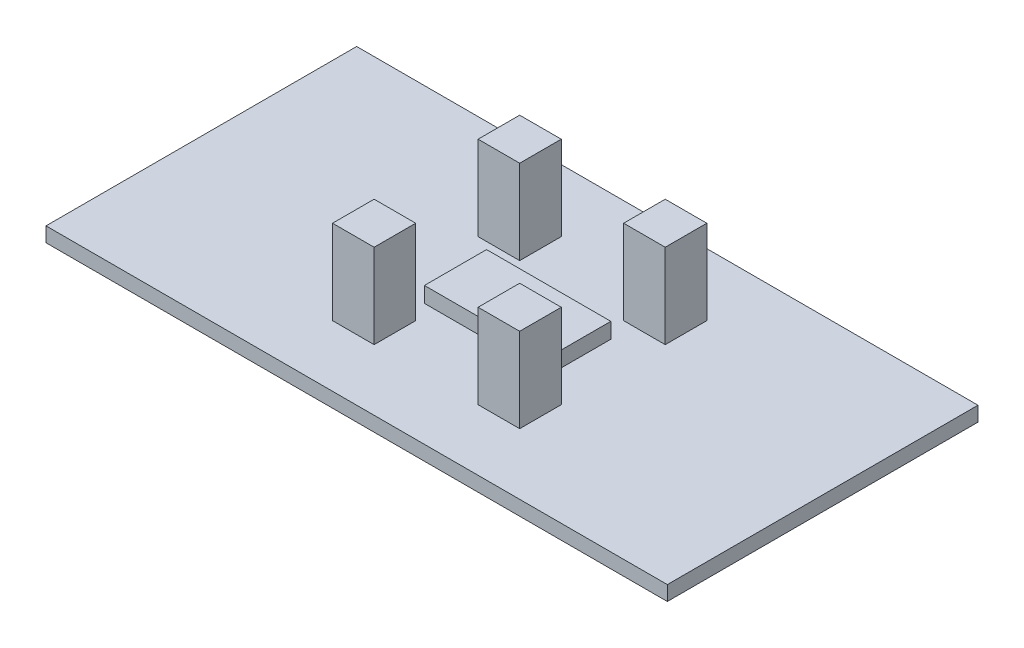
ISO-10303-21;
HEADER;
FILE_DESCRIPTION(('STEP AP214'),'2;1');
FILE_NAME('part.step','',(''),(''),'','','');
FILE_SCHEMA(('AUTOMOTIVE_DESIGN { 1 0 10303 214 1 1 1 1 }'));
ENDSEC;
DATA;
#1=APPLICATION_CONTEXT('core data for automotive mechanical design processes');
#2=APPLICATION_PROTOCOL_DEFINITION('international standard','automotive_design',2000,#1);
#3=PRODUCT_CONTEXT('',#1,'mechanical');
#4=PRODUCT('Part','Part','',(#3));
#5=PRODUCT_RELATED_PRODUCT_CATEGORY('part','',(#4));
#6=PRODUCT_DEFINITION_FORMATION('','',#4);
#7=PRODUCT_DEFINITION_CONTEXT('part definition',#1,'design');
#8=PRODUCT_DEFINITION('design','',#6,#7);
#9=PRODUCT_DEFINITION_SHAPE('','',#8);
#10=(LENGTH_UNIT() NAMED_UNIT(*) SI_UNIT(.MILLI.,.METRE.));
#11=(NAMED_UNIT(*) PLANE_ANGLE_UNIT() SI_UNIT($,.RADIAN.));
#12=(NAMED_UNIT(*) SI_UNIT($,.STERADIAN.) SOLID_ANGLE_UNIT());
#13=UNCERTAINTY_MEASURE_WITH_UNIT(LENGTH_MEASURE(1.E-05),#10,'distance_accuracy_value','');
#14=(GEOMETRIC_REPRESENTATION_CONTEXT(3) GLOBAL_UNCERTAINTY_ASSIGNED_CONTEXT((#13)) GLOBAL_UNIT_ASSIGNED_CONTEXT((#10,
#11,#12)) REPRESENTATION_CONTEXT('',''));
#15=CARTESIAN_POINT('',(0.,0.,0.));
#16=DIRECTION('',(0.,0.,1.));
#17=DIRECTION('',(1.,0.,0.));
#18=AXIS2_PLACEMENT_3D('',#15,#16,#17);
#19=CARTESIAN_POINT('',(15.4033333333334,81.,38.1619047619049));
#20=DIRECTION('',(1.,0.,0.));
#21=DIRECTION('',(0.,0.,-1.));
#22=AXIS2_PLACEMENT_3D('',#19,#20,#21);
#23=PLANE('',#22);
#24=DIRECTION('',(0.,0.,1.));
#25=VECTOR('',#24,1.);
#26=CARTESIAN_POINT('',(15.4033333333334,12.,38.1619047619049));
#27=LINE('',#26,#25);
#28=CARTESIAN_POINT('',(15.4033333333334,12.,38.1619047619049));
#29=VERTEX_POINT('',#28);
#30=CARTESIAN_POINT('',(15.4033333333334,12.,72.1619047619049));
#31=VERTEX_POINT('',#30);
#32=EDGE_CURVE('E113',#29,#31,#27,.T.);
#33=ORIENTED_EDGE('',*,*,#32,.T.);
#34=DIRECTION('',(0.,-1.,0.));
#35=VECTOR('',#34,1.);
#36=CARTESIAN_POINT('',(15.4033333333334,81.,72.1619047619049));
#37=LINE('',#36,#35);
#38=CARTESIAN_POINT('',(15.4033333333334,81.,72.1619047619049));
#39=VERTEX_POINT('',#38);
#40=EDGE_CURVE('E12',#39,#31,#37,.T.);
#41=ORIENTED_EDGE('',*,*,#40,.F.);
#42=DIRECTION('',(0.,0.,1.));
#43=VECTOR('',#42,1.);
#44=CARTESIAN_POINT('',(15.4033333333334,81.,38.1619047619049));
#45=LINE('',#44,#43);
#46=CARTESIAN_POINT('',(15.4033333333334,81.,38.1619047619049));
#47=VERTEX_POINT('',#46);
#48=EDGE_CURVE('E101',#47,#39,#45,.T.);
#49=ORIENTED_EDGE('',*,*,#48,.F.);
#50=DIRECTION('',(0.,-1.,0.));
#51=VECTOR('',#50,1.);
#52=CARTESIAN_POINT('',(15.4033333333334,81.,38.1619047619049));
#53=LINE('',#52,#51);
#54=EDGE_CURVE('E109',#47,#29,#53,.T.);
#55=ORIENTED_EDGE('',*,*,#54,.T.);
#56=EDGE_LOOP('',(#33,#41,#49,#55));
#57=FACE_BOUND('',#56,.T.);
#58=ADVANCED_FACE('F50',(#57),#23,.F.);
#59=CARTESIAN_POINT('',(15.4033333333334,81.,72.1619047619049));
#60=DIRECTION('',(0.,0.,-1.));
#61=DIRECTION('',(-1.,0.,0.));
#62=AXIS2_PLACEMENT_3D('',#59,#60,#61);
#63=PLANE('',#62);
#64=DIRECTION('',(1.,0.,0.));
#65=VECTOR('',#64,1.);
#66=CARTESIAN_POINT('',(15.4033333333334,12.,72.1619047619049));
#67=LINE('',#66,#65);
#68=CARTESIAN_POINT('',(49.4033333333335,12.,72.1619047619049));
#69=VERTEX_POINT('',#68);
#70=EDGE_CURVE('E105',#31,#69,#67,.T.);
#71=ORIENTED_EDGE('',*,*,#70,.T.);
#72=DIRECTION('',(0.,-1.,0.));
#73=VECTOR('',#72,1.);
#74=CARTESIAN_POINT('',(49.4033333333335,81.,72.1619047619049));
#75=LINE('',#74,#73);
#76=CARTESIAN_POINT('',(49.4033333333335,81.,72.1619047619049));
#77=VERTEX_POINT('',#76);
#78=EDGE_CURVE('E58',#77,#69,#75,.T.);
#79=ORIENTED_EDGE('',*,*,#78,.F.);
#80=DIRECTION('',(1.,0.,0.));
#81=VECTOR('',#80,1.);
#82=CARTESIAN_POINT('',(15.4033333333334,81.,72.1619047619049));
#83=LINE('',#82,#81);
#84=EDGE_CURVE('E96',#39,#77,#83,.T.);
#85=ORIENTED_EDGE('',*,*,#84,.F.);
#86=ORIENTED_EDGE('',*,*,#40,.T.);
#87=EDGE_LOOP('',(#71,#79,#85,#86));
#88=FACE_BOUND('',#87,.T.);
#89=ADVANCED_FACE('F104',(#88),#63,.F.);
#90=CARTESIAN_POINT('',(49.4033333333336,81.,38.1619047619049));
#91=DIRECTION('',(-1.,0.,0.));
#92=DIRECTION('',(0.,0.,1.));
#93=AXIS2_PLACEMENT_3D('',#90,#91,#92);
#94=PLANE('',#93);
#95=DIRECTION('',(0.,0.,-1.));
#96=VECTOR('',#95,1.);
#97=CARTESIAN_POINT('',(49.4033333333336,12.,38.1619047619049));
#98=LINE('',#97,#96);
#99=CARTESIAN_POINT('',(49.4033333333336,12.,38.1619047619049));
#100=VERTEX_POINT('',#99);
#101=EDGE_CURVE('E83',#69,#100,#98,.T.);
#102=ORIENTED_EDGE('',*,*,#101,.T.);
#103=DIRECTION('',(0.,-1.,0.));
#104=VECTOR('',#103,1.);
#105=CARTESIAN_POINT('',(49.4033333333336,81.,38.1619047619049));
#106=LINE('',#105,#104);
#107=CARTESIAN_POINT('',(49.4033333333336,81.,38.1619047619049));
#108=VERTEX_POINT('',#107);
#109=EDGE_CURVE('E106',#108,#100,#106,.T.);
#110=ORIENTED_EDGE('',*,*,#109,.F.);
#111=DIRECTION('',(0.,0.,-1.));
#112=VECTOR('',#111,1.);
#113=CARTESIAN_POINT('',(49.4033333333336,81.,38.1619047619049));
#114=LINE('',#113,#112);
#115=EDGE_CURVE('E99',#77,#108,#114,.T.);
#116=ORIENTED_EDGE('',*,*,#115,.F.);
#117=ORIENTED_EDGE('',*,*,#78,.T.);
#118=EDGE_LOOP('',(#102,#110,#116,#117));
#119=FACE_BOUND('',#118,.T.);
#120=ADVANCED_FACE('F107',(#119),#94,.F.);
#121=CARTESIAN_POINT('',(15.4033333333334,81.,38.1619047619049));
#122=DIRECTION('',(0.,0.,1.));
#123=DIRECTION('',(1.,0.,0.));
#124=AXIS2_PLACEMENT_3D('',#121,#122,#123);
#125=PLANE('',#124);
#126=DIRECTION('',(-1.,0.,0.));
#127=VECTOR('',#126,1.);
#128=CARTESIAN_POINT('',(15.4033333333334,12.,38.1619047619049));
#129=LINE('',#128,#127);
#130=EDGE_CURVE('E89',#100,#29,#129,.T.);
#131=ORIENTED_EDGE('',*,*,#130,.T.);
#132=ORIENTED_EDGE('',*,*,#54,.F.);
#133=DIRECTION('',(-1.,0.,0.));
#134=VECTOR('',#133,1.);
#135=CARTESIAN_POINT('',(15.4033333333334,81.,38.1619047619049));
#136=LINE('',#135,#134);
#137=EDGE_CURVE('E66',#108,#47,#136,.T.);
#138=ORIENTED_EDGE('',*,*,#137,.F.);
#139=ORIENTED_EDGE('',*,*,#109,.T.);
#140=EDGE_LOOP('',(#131,#132,#138,#139));
#141=FACE_BOUND('',#140,.T.);
#142=ADVANCED_FACE('F120',(#141),#125,.F.);
#143=CARTESIAN_POINT('',(0.,81.,0.));
#144=DIRECTION('',(0.,1.,0.));
#145=DIRECTION('',(0.,0.,1.));
#146=AXIS2_PLACEMENT_3D('',#143,#144,#145);
#147=PLANE('',#146);
#148=ORIENTED_EDGE('',*,*,#48,.T.);
#149=ORIENTED_EDGE('',*,*,#84,.T.);
#150=ORIENTED_EDGE('',*,*,#115,.T.);
#151=ORIENTED_EDGE('',*,*,#137,.T.);
#152=EDGE_LOOP('',(#148,#149,#150,#151));
#153=FACE_BOUND('',#152,.T.);
#154=ADVANCED_FACE('F97',(#153),#147,.T.);
#155=CARTESIAN_POINT('',(0.,12.,0.));
#156=DIRECTION('',(0.,1.,0.));
#157=DIRECTION('',(0.,0.,1.));
#158=AXIS2_PLACEMENT_3D('',#155,#156,#157);
#159=PLANE('',#158);
#160=ORIENTED_EDGE('',*,*,#32,.F.);
#161=ORIENTED_EDGE('',*,*,#130,.F.);
#162=ORIENTED_EDGE('',*,*,#101,.F.);
#163=ORIENTED_EDGE('',*,*,#70,.F.);
#164=EDGE_LOOP('',(#160,#161,#162,#163));
#165=FACE_BOUND('',#164,.T.);
#166=ADVANCED_FACE('F123',(#165),#159,.F.);
#167=CLOSED_SHELL('',(#58,#89,#120,#142,#154,#166));
#168=MANIFOLD_SOLID_BREP('B2',#167);
#169=CARTESIAN_POINT('',(-103.596666666667,81.,38.1619047619048));
#170=DIRECTION('',(1.,0.,0.));
#171=DIRECTION('',(0.,0.,-1.));
#172=AXIS2_PLACEMENT_3D('',#169,#170,#171);
#173=PLANE('',#172);
#174=DIRECTION('',(0.,0.,1.));
#175=VECTOR('',#174,1.);
#176=CARTESIAN_POINT('',(-103.596666666667,12.,38.1619047619048));
#177=LINE('',#176,#175);
#178=CARTESIAN_POINT('',(-103.596666666667,12.,38.1619047619048));
#179=VERTEX_POINT('',#178);
#180=CARTESIAN_POINT('',(-103.596666666667,12.,72.1619047619048));
#181=VERTEX_POINT('',#180);
#182=EDGE_CURVE('E247',#179,#181,#177,.T.);
#183=ORIENTED_EDGE('',*,*,#182,.T.);
#184=DIRECTION('',(0.,-1.,0.));
#185=VECTOR('',#184,1.);
#186=CARTESIAN_POINT('',(-103.596666666667,81.,72.1619047619048));
#187=LINE('',#186,#185);
#188=CARTESIAN_POINT('',(-103.596666666667,81.,72.1619047619048));
#189=VERTEX_POINT('',#188);
#190=EDGE_CURVE('E48',#189,#181,#187,.T.);
#191=ORIENTED_EDGE('',*,*,#190,.F.);
#192=DIRECTION('',(0.,0.,1.));
#193=VECTOR('',#192,1.);
#194=CARTESIAN_POINT('',(-103.596666666667,81.,38.1619047619048));
#195=LINE('',#194,#193);
#196=CARTESIAN_POINT('',(-103.596666666667,81.,38.1619047619048));
#197=VERTEX_POINT('',#196);
#198=EDGE_CURVE('E235',#197,#189,#195,.T.);
#199=ORIENTED_EDGE('',*,*,#198,.F.);
#200=DIRECTION('',(0.,-1.,0.));
#201=VECTOR('',#200,1.);
#202=CARTESIAN_POINT('',(-103.596666666667,81.,38.1619047619048));
#203=LINE('',#202,#201);
#204=EDGE_CURVE('E243',#197,#179,#203,.T.);
#205=ORIENTED_EDGE('',*,*,#204,.T.);
#206=EDGE_LOOP('',(#183,#191,#199,#205));
#207=FACE_BOUND('',#206,.T.);
#208=ADVANCED_FACE('F184',(#207),#173,.F.);
#209=CARTESIAN_POINT('',(-103.596666666667,81.,72.1619047619048));
#210=DIRECTION('',(0.,0.,-1.));
#211=DIRECTION('',(-1.,0.,0.));
#212=AXIS2_PLACEMENT_3D('',#209,#210,#211);
#213=PLANE('',#212);
#214=DIRECTION('',(1.,0.,0.));
#215=VECTOR('',#214,1.);
#216=CARTESIAN_POINT('',(-103.596666666667,12.,72.1619047619048));
#217=LINE('',#216,#215);
#218=CARTESIAN_POINT('',(-69.5966666666666,12.,72.1619047619048));
#219=VERTEX_POINT('',#218);
#220=EDGE_CURVE('E239',#181,#219,#217,.T.);
#221=ORIENTED_EDGE('',*,*,#220,.T.);
#222=DIRECTION('',(0.,-1.,0.));
#223=VECTOR('',#222,1.);
#224=CARTESIAN_POINT('',(-69.5966666666666,81.,72.1619047619048));
#225=LINE('',#224,#223);
#226=CARTESIAN_POINT('',(-69.5966666666666,81.,72.1619047619048));
#227=VERTEX_POINT('',#226);
#228=EDGE_CURVE('E192',#227,#219,#225,.T.);
#229=ORIENTED_EDGE('',*,*,#228,.F.);
#230=DIRECTION('',(1.,0.,0.));
#231=VECTOR('',#230,1.);
#232=CARTESIAN_POINT('',(-103.596666666667,81.,72.1619047619048));
#233=LINE('',#232,#231);
#234=EDGE_CURVE('E230',#189,#227,#233,.T.);
#235=ORIENTED_EDGE('',*,*,#234,.F.);
#236=ORIENTED_EDGE('',*,*,#190,.T.);
#237=EDGE_LOOP('',(#221,#229,#235,#236));
#238=FACE_BOUND('',#237,.T.);
#239=ADVANCED_FACE('F238',(#238),#213,.F.);
#240=CARTESIAN_POINT('',(-69.5966666666666,81.,38.1619047619049));
#241=DIRECTION('',(-1.,0.,0.));
#242=DIRECTION('',(0.,0.,1.));
#243=AXIS2_PLACEMENT_3D('',#240,#241,#242);
#244=PLANE('',#243);
#245=DIRECTION('',(0.,0.,-1.));
#246=VECTOR('',#245,1.);
#247=CARTESIAN_POINT('',(-69.5966666666666,12.,38.1619047619049));
#248=LINE('',#247,#246);
#249=CARTESIAN_POINT('',(-69.5966666666666,12.,38.1619047619049));
#250=VERTEX_POINT('',#249);
#251=EDGE_CURVE('E217',#219,#250,#248,.T.);
#252=ORIENTED_EDGE('',*,*,#251,.T.);
#253=DIRECTION('',(0.,-1.,0.));
#254=VECTOR('',#253,1.);
#255=CARTESIAN_POINT('',(-69.5966666666666,81.,38.1619047619049));
#256=LINE('',#255,#254);
#257=CARTESIAN_POINT('',(-69.5966666666666,81.,38.1619047619049));
#258=VERTEX_POINT('',#257);
#259=EDGE_CURVE('E240',#258,#250,#256,.T.);
#260=ORIENTED_EDGE('',*,*,#259,.F.);
#261=DIRECTION('',(0.,0.,-1.));
#262=VECTOR('',#261,1.);
#263=CARTESIAN_POINT('',(-69.5966666666666,81.,38.1619047619049));
#264=LINE('',#263,#262);
#265=EDGE_CURVE('E233',#227,#258,#264,.T.);
#266=ORIENTED_EDGE('',*,*,#265,.F.);
#267=ORIENTED_EDGE('',*,*,#228,.T.);
#268=EDGE_LOOP('',(#252,#260,#266,#267));
#269=FACE_BOUND('',#268,.T.);
#270=ADVANCED_FACE('F241',(#269),#244,.F.);
#271=CARTESIAN_POINT('',(-103.596666666667,81.,38.1619047619048));
#272=DIRECTION('',(0.,0.,1.));
#273=DIRECTION('',(1.,0.,0.));
#274=AXIS2_PLACEMENT_3D('',#271,#272,#273);
#275=PLANE('',#274);
#276=DIRECTION('',(-1.,0.,0.));
#277=VECTOR('',#276,1.);
#278=CARTESIAN_POINT('',(-103.596666666667,12.,38.1619047619048));
#279=LINE('',#278,#277);
#280=EDGE_CURVE('E223',#250,#179,#279,.T.);
#281=ORIENTED_EDGE('',*,*,#280,.T.);
#282=ORIENTED_EDGE('',*,*,#204,.F.);
#283=DIRECTION('',(-1.,0.,0.));
#284=VECTOR('',#283,1.);
#285=CARTESIAN_POINT('',(-103.596666666667,81.,38.1619047619048));
#286=LINE('',#285,#284);
#287=EDGE_CURVE('E200',#258,#197,#286,.T.);
#288=ORIENTED_EDGE('',*,*,#287,.F.);
#289=ORIENTED_EDGE('',*,*,#259,.T.);
#290=EDGE_LOOP('',(#281,#282,#288,#289));
#291=FACE_BOUND('',#290,.T.);
#292=ADVANCED_FACE('F254',(#291),#275,.F.);
#293=CARTESIAN_POINT('',(0.,81.,0.));
#294=DIRECTION('',(0.,1.,0.));
#295=DIRECTION('',(0.,0.,1.));
#296=AXIS2_PLACEMENT_3D('',#293,#294,#295);
#297=PLANE('',#296);
#298=ORIENTED_EDGE('',*,*,#198,.T.);
#299=ORIENTED_EDGE('',*,*,#234,.T.);
#300=ORIENTED_EDGE('',*,*,#265,.T.);
#301=ORIENTED_EDGE('',*,*,#287,.T.);
#302=EDGE_LOOP('',(#298,#299,#300,#301));
#303=FACE_BOUND('',#302,.T.);
#304=ADVANCED_FACE('F231',(#303),#297,.T.);
#305=CARTESIAN_POINT('',(0.,12.,0.));
#306=DIRECTION('',(0.,1.,0.));
#307=DIRECTION('',(0.,0.,1.));
#308=AXIS2_PLACEMENT_3D('',#305,#306,#307);
#309=PLANE('',#308);
#310=ORIENTED_EDGE('',*,*,#182,.F.);
#311=ORIENTED_EDGE('',*,*,#280,.F.);
#312=ORIENTED_EDGE('',*,*,#251,.F.);
#313=ORIENTED_EDGE('',*,*,#220,.F.);
#314=EDGE_LOOP('',(#310,#311,#312,#313));
#315=FACE_BOUND('',#314,.T.);
#316=ADVANCED_FACE('F257',(#315),#309,.F.);
#317=CLOSED_SHELL('',(#208,#239,#270,#292,#304,#316));
#318=MANIFOLD_SOLID_BREP('B6',#317);
#319=CARTESIAN_POINT('',(-103.596666666667,81.,-80.8380952380952));
#320=DIRECTION('',(1.,0.,0.));
#321=DIRECTION('',(0.,0.,-1.));
#322=AXIS2_PLACEMENT_3D('',#319,#320,#321);
#323=PLANE('',#322);
#324=DIRECTION('',(0.,0.,1.));
#325=VECTOR('',#324,1.);
#326=CARTESIAN_POINT('',(-103.596666666667,12.,-80.8380952380952));
#327=LINE('',#326,#325);
#328=CARTESIAN_POINT('',(-103.596666666667,12.,-80.8380952380952));
#329=VERTEX_POINT('',#328);
#330=CARTESIAN_POINT('',(-103.596666666667,12.,-46.8380952380952));
#331=VERTEX_POINT('',#330);
#332=EDGE_CURVE('E381',#329,#331,#327,.T.);
#333=ORIENTED_EDGE('',*,*,#332,.T.);
#334=DIRECTION('',(0.,-1.,0.));
#335=VECTOR('',#334,1.);
#336=CARTESIAN_POINT('',(-103.596666666667,81.,-46.8380952380952));
#337=LINE('',#336,#335);
#338=CARTESIAN_POINT('',(-103.596666666667,81.,-46.8380952380952));
#339=VERTEX_POINT('',#338);
#340=EDGE_CURVE('E182',#339,#331,#337,.T.);
#341=ORIENTED_EDGE('',*,*,#340,.F.);
#342=DIRECTION('',(0.,0.,1.));
#343=VECTOR('',#342,1.);
#344=CARTESIAN_POINT('',(-103.596666666667,81.,-80.8380952380952));
#345=LINE('',#344,#343);
#346=CARTESIAN_POINT('',(-103.596666666667,81.,-80.8380952380952));
#347=VERTEX_POINT('',#346);
#348=EDGE_CURVE('E369',#347,#339,#345,.T.);
#349=ORIENTED_EDGE('',*,*,#348,.F.);
#350=DIRECTION('',(0.,-1.,0.));
#351=VECTOR('',#350,1.);
#352=CARTESIAN_POINT('',(-103.596666666667,81.,-80.8380952380952));
#353=LINE('',#352,#351);
#354=EDGE_CURVE('E377',#347,#329,#353,.T.);
#355=ORIENTED_EDGE('',*,*,#354,.T.);
#356=EDGE_LOOP('',(#333,#341,#349,#355));
#357=FACE_BOUND('',#356,.T.);
#358=ADVANCED_FACE('F318',(#357),#323,.F.);
#359=CARTESIAN_POINT('',(-103.596666666667,81.,-46.8380952380952));
#360=DIRECTION('',(0.,0.,-1.));
#361=DIRECTION('',(-1.,0.,0.));
#362=AXIS2_PLACEMENT_3D('',#359,#360,#361);
#363=PLANE('',#362);
#364=DIRECTION('',(1.,0.,0.));
#365=VECTOR('',#364,1.);
#366=CARTESIAN_POINT('',(-103.596666666667,12.,-46.8380952380952));
#367=LINE('',#366,#365);
#368=CARTESIAN_POINT('',(-69.5966666666666,12.,-46.8380952380952));
#369=VERTEX_POINT('',#368);
#370=EDGE_CURVE('E373',#331,#369,#367,.T.);
#371=ORIENTED_EDGE('',*,*,#370,.T.);
#372=DIRECTION('',(0.,-1.,0.));
#373=VECTOR('',#372,1.);
#374=CARTESIAN_POINT('',(-69.5966666666666,81.,-46.8380952380952));
#375=LINE('',#374,#373);
#376=CARTESIAN_POINT('',(-69.5966666666666,81.,-46.8380952380952));
#377=VERTEX_POINT('',#376);
#378=EDGE_CURVE('E326',#377,#369,#375,.T.);
#379=ORIENTED_EDGE('',*,*,#378,.F.);
#380=DIRECTION('',(1.,0.,0.));
#381=VECTOR('',#380,1.);
#382=CARTESIAN_POINT('',(-103.596666666667,81.,-46.8380952380952));
#383=LINE('',#382,#381);
#384=EDGE_CURVE('E364',#339,#377,#383,.T.);
#385=ORIENTED_EDGE('',*,*,#384,.F.);
#386=ORIENTED_EDGE('',*,*,#340,.T.);
#387=EDGE_LOOP('',(#371,#379,#385,#386));
#388=FACE_BOUND('',#387,.T.);
#389=ADVANCED_FACE('F372',(#388),#363,.F.);
#390=CARTESIAN_POINT('',(-69.5966666666666,81.,-80.8380952380952));
#391=DIRECTION('',(-1.,0.,0.));
#392=DIRECTION('',(0.,0.,1.));
#393=AXIS2_PLACEMENT_3D('',#390,#391,#392);
#394=PLANE('',#393);
#395=DIRECTION('',(0.,0.,-1.));
#396=VECTOR('',#395,1.);
#397=CARTESIAN_POINT('',(-69.5966666666666,12.,-80.8380952380952));
#398=LINE('',#397,#396);
#399=CARTESIAN_POINT('',(-69.5966666666666,12.,-80.8380952380952));
#400=VERTEX_POINT('',#399);
#401=EDGE_CURVE('E351',#369,#400,#398,.T.);
#402=ORIENTED_EDGE('',*,*,#401,.T.);
#403=DIRECTION('',(0.,-1.,0.));
#404=VECTOR('',#403,1.);
#405=CARTESIAN_POINT('',(-69.5966666666666,81.,-80.8380952380952));
#406=LINE('',#405,#404);
#407=CARTESIAN_POINT('',(-69.5966666666666,81.,-80.8380952380952));
#408=VERTEX_POINT('',#407);
#409=EDGE_CURVE('E374',#408,#400,#406,.T.);
#410=ORIENTED_EDGE('',*,*,#409,.F.);
#411=DIRECTION('',(0.,0.,-1.));
#412=VECTOR('',#411,1.);
#413=CARTESIAN_POINT('',(-69.5966666666666,81.,-80.8380952380952));
#414=LINE('',#413,#412);
#415=EDGE_CURVE('E367',#377,#408,#414,.T.);
#416=ORIENTED_EDGE('',*,*,#415,.F.);
#417=ORIENTED_EDGE('',*,*,#378,.T.);
#418=EDGE_LOOP('',(#402,#410,#416,#417));
#419=FACE_BOUND('',#418,.T.);
#420=ADVANCED_FACE('F375',(#419),#394,.F.);
#421=CARTESIAN_POINT('',(-103.596666666667,81.,-80.8380952380952));
#422=DIRECTION('',(0.,0.,1.));
#423=DIRECTION('',(1.,0.,0.));
#424=AXIS2_PLACEMENT_3D('',#421,#422,#423);
#425=PLANE('',#424);
#426=DIRECTION('',(-1.,0.,0.));
#427=VECTOR('',#426,1.);
#428=CARTESIAN_POINT('',(-103.596666666667,12.,-80.8380952380952));
#429=LINE('',#428,#427);
#430=EDGE_CURVE('E357',#400,#329,#429,.T.);
#431=ORIENTED_EDGE('',*,*,#430,.T.);
#432=ORIENTED_EDGE('',*,*,#354,.F.);
#433=DIRECTION('',(-1.,0.,0.));
#434=VECTOR('',#433,1.);
#435=CARTESIAN_POINT('',(-103.596666666667,81.,-80.8380952380952));
#436=LINE('',#435,#434);
#437=EDGE_CURVE('E334',#408,#347,#436,.T.);
#438=ORIENTED_EDGE('',*,*,#437,.F.);
#439=ORIENTED_EDGE('',*,*,#409,.T.);
#440=EDGE_LOOP('',(#431,#432,#438,#439));
#441=FACE_BOUND('',#440,.T.);
#442=ADVANCED_FACE('F388',(#441),#425,.F.);
#443=CARTESIAN_POINT('',(0.,81.,0.));
#444=DIRECTION('',(0.,1.,0.));
#445=DIRECTION('',(0.,0.,1.));
#446=AXIS2_PLACEMENT_3D('',#443,#444,#445);
#447=PLANE('',#446);
#448=ORIENTED_EDGE('',*,*,#348,.T.);
#449=ORIENTED_EDGE('',*,*,#384,.T.);
#450=ORIENTED_EDGE('',*,*,#415,.T.);
#451=ORIENTED_EDGE('',*,*,#437,.T.);
#452=EDGE_LOOP('',(#448,#449,#450,#451));
#453=FACE_BOUND('',#452,.T.);
#454=ADVANCED_FACE('F365',(#453),#447,.T.);
#455=CARTESIAN_POINT('',(0.,12.,0.));
#456=DIRECTION('',(0.,1.,0.));
#457=DIRECTION('',(0.,0.,1.));
#458=AXIS2_PLACEMENT_3D('',#455,#456,#457);
#459=PLANE('',#458);
#460=ORIENTED_EDGE('',*,*,#332,.F.);
#461=ORIENTED_EDGE('',*,*,#430,.F.);
#462=ORIENTED_EDGE('',*,*,#401,.F.);
#463=ORIENTED_EDGE('',*,*,#370,.F.);
#464=EDGE_LOOP('',(#460,#461,#462,#463));
#465=FACE_BOUND('',#464,.T.);
#466=ADVANCED_FACE('F391',(#465),#459,.F.);
#467=CLOSED_SHELL('',(#358,#389,#420,#442,#454,#466));
#468=MANIFOLD_SOLID_BREP('B42',#467);
#469=CARTESIAN_POINT('',(15.4033333333334,81.,-80.8380952380951));
#470=DIRECTION('',(1.,0.,0.));
#471=DIRECTION('',(0.,0.,-1.));
#472=AXIS2_PLACEMENT_3D('',#469,#470,#471);
#473=PLANE('',#472);
#474=DIRECTION('',(0.,0.,1.));
#475=VECTOR('',#474,1.);
#476=CARTESIAN_POINT('',(15.4033333333334,12.,-80.8380952380951));
#477=LINE('',#476,#475);
#478=CARTESIAN_POINT('',(15.4033333333334,12.,-80.8380952380951));
#479=VERTEX_POINT('',#478);
#480=CARTESIAN_POINT('',(15.4033333333334,12.,-46.8380952380951));
#481=VERTEX_POINT('',#480);
#482=EDGE_CURVE('E514',#479,#481,#477,.T.);
#483=ORIENTED_EDGE('',*,*,#482,.T.);
#484=DIRECTION('',(0.,-1.,0.));
#485=VECTOR('',#484,1.);
#486=CARTESIAN_POINT('',(15.4033333333334,81.,-46.8380952380951));
#487=LINE('',#486,#485);
#488=CARTESIAN_POINT('',(15.4033333333334,81.,-46.8380952380951));
#489=VERTEX_POINT('',#488);
#490=EDGE_CURVE('E316',#489,#481,#487,.T.);
#491=ORIENTED_EDGE('',*,*,#490,.F.);
#492=DIRECTION('',(0.,0.,1.));
#493=VECTOR('',#492,1.);
#494=CARTESIAN_POINT('',(15.4033333333334,81.,-80.8380952380951));
#495=LINE('',#494,#493);
#496=CARTESIAN_POINT('',(15.4033333333334,81.,-80.8380952380951));
#497=VERTEX_POINT('',#496);
#498=EDGE_CURVE('E502',#497,#489,#495,.T.);
#499=ORIENTED_EDGE('',*,*,#498,.F.);
#500=DIRECTION('',(0.,-1.,0.));
#501=VECTOR('',#500,1.);
#502=CARTESIAN_POINT('',(15.4033333333334,81.,-80.8380952380951));
#503=LINE('',#502,#501);
#504=EDGE_CURVE('E510',#497,#479,#503,.T.);
#505=ORIENTED_EDGE('',*,*,#504,.T.);
#506=EDGE_LOOP('',(#483,#491,#499,#505));
#507=FACE_BOUND('',#506,.T.);
#508=ADVANCED_FACE('F451',(#507),#473,.F.);
#509=CARTESIAN_POINT('',(15.4033333333334,81.,-46.8380952380951));
#510=DIRECTION('',(0.,0.,-1.));
#511=DIRECTION('',(-1.,0.,0.));
#512=AXIS2_PLACEMENT_3D('',#509,#510,#511);
#513=PLANE('',#512);
#514=DIRECTION('',(1.,0.,0.));
#515=VECTOR('',#514,1.);
#516=CARTESIAN_POINT('',(15.4033333333334,12.,-46.8380952380951));
#517=LINE('',#516,#515);
#518=CARTESIAN_POINT('',(49.4033333333333,12.,-46.8380952380952));
#519=VERTEX_POINT('',#518);
#520=EDGE_CURVE('E506',#481,#519,#517,.T.);
#521=ORIENTED_EDGE('',*,*,#520,.T.);
#522=DIRECTION('',(0.,-1.,0.));
#523=VECTOR('',#522,1.);
#524=CARTESIAN_POINT('',(49.4033333333333,81.,-46.8380952380952));
#525=LINE('',#524,#523);
#526=CARTESIAN_POINT('',(49.4033333333333,81.,-46.8380952380952));
#527=VERTEX_POINT('',#526);
#528=EDGE_CURVE('E459',#527,#519,#525,.T.);
#529=ORIENTED_EDGE('',*,*,#528,.F.);
#530=DIRECTION('',(1.,0.,0.));
#531=VECTOR('',#530,1.);
#532=CARTESIAN_POINT('',(15.4033333333334,81.,-46.8380952380951));
#533=LINE('',#532,#531);
#534=EDGE_CURVE('E497',#489,#527,#533,.T.);
#535=ORIENTED_EDGE('',*,*,#534,.F.);
#536=ORIENTED_EDGE('',*,*,#490,.T.);
#537=EDGE_LOOP('',(#521,#529,#535,#536));
#538=FACE_BOUND('',#537,.T.);
#539=ADVANCED_FACE('F505',(#538),#513,.F.);
#540=CARTESIAN_POINT('',(49.4033333333333,81.,-80.8380952380951));
#541=DIRECTION('',(-1.,0.,0.));
#542=DIRECTION('',(0.,0.,1.));
#543=AXIS2_PLACEMENT_3D('',#540,#541,#542);
#544=PLANE('',#543);
#545=DIRECTION('',(0.,0.,-1.));
#546=VECTOR('',#545,1.);
#547=CARTESIAN_POINT('',(49.4033333333333,12.,-80.8380952380951));
#548=LINE('',#547,#546);
#549=CARTESIAN_POINT('',(49.4033333333333,12.,-80.8380952380951));
#550=VERTEX_POINT('',#549);
#551=EDGE_CURVE('E484',#519,#550,#548,.T.);
#552=ORIENTED_EDGE('',*,*,#551,.T.);
#553=DIRECTION('',(0.,-1.,0.));
#554=VECTOR('',#553,1.);
#555=CARTESIAN_POINT('',(49.4033333333333,81.,-80.8380952380951));
#556=LINE('',#555,#554);
#557=CARTESIAN_POINT('',(49.4033333333333,81.,-80.8380952380951));
#558=VERTEX_POINT('',#557);
#559=EDGE_CURVE('E507',#558,#550,#556,.T.);
#560=ORIENTED_EDGE('',*,*,#559,.F.);
#561=DIRECTION('',(0.,0.,-1.));
#562=VECTOR('',#561,1.);
#563=CARTESIAN_POINT('',(49.4033333333333,81.,-80.8380952380951));
#564=LINE('',#563,#562);
#565=EDGE_CURVE('E500',#527,#558,#564,.T.);
#566=ORIENTED_EDGE('',*,*,#565,.F.);
#567=ORIENTED_EDGE('',*,*,#528,.T.);
#568=EDGE_LOOP('',(#552,#560,#566,#567));
#569=FACE_BOUND('',#568,.T.);
#570=ADVANCED_FACE('F508',(#569),#544,.F.);
#571=CARTESIAN_POINT('',(15.4033333333334,81.,-80.8380952380951));
#572=DIRECTION('',(0.,0.,1.));
#573=DIRECTION('',(1.,0.,0.));
#574=AXIS2_PLACEMENT_3D('',#571,#572,#573);
#575=PLANE('',#574);
#576=DIRECTION('',(-1.,0.,0.));
#577=VECTOR('',#576,1.);
#578=CARTESIAN_POINT('',(15.4033333333334,12.,-80.8380952380951));
#579=LINE('',#578,#577);
#580=EDGE_CURVE('E490',#550,#479,#579,.T.);
#581=ORIENTED_EDGE('',*,*,#580,.T.);
#582=ORIENTED_EDGE('',*,*,#504,.F.);
#583=DIRECTION('',(-1.,0.,0.));
#584=VECTOR('',#583,1.);
#585=CARTESIAN_POINT('',(15.4033333333334,81.,-80.8380952380951));
#586=LINE('',#585,#584);
#587=EDGE_CURVE('E467',#558,#497,#586,.T.);
#588=ORIENTED_EDGE('',*,*,#587,.F.);
#589=ORIENTED_EDGE('',*,*,#559,.T.);
#590=EDGE_LOOP('',(#581,#582,#588,#589));
#591=FACE_BOUND('',#590,.T.);
#592=ADVANCED_FACE('F521',(#591),#575,.F.);
#593=CARTESIAN_POINT('',(0.,81.,0.));
#594=DIRECTION('',(0.,1.,0.));
#595=DIRECTION('',(0.,0.,1.));
#596=AXIS2_PLACEMENT_3D('',#593,#594,#595);
#597=PLANE('',#596);
#598=ORIENTED_EDGE('',*,*,#498,.T.);
#599=ORIENTED_EDGE('',*,*,#534,.T.);
#600=ORIENTED_EDGE('',*,*,#565,.T.);
#601=ORIENTED_EDGE('',*,*,#587,.T.);
#602=EDGE_LOOP('',(#598,#599,#600,#601));
#603=FACE_BOUND('',#602,.T.);
#604=ADVANCED_FACE('F498',(#603),#597,.T.);
#605=CARTESIAN_POINT('',(0.,12.,0.));
#606=DIRECTION('',(0.,1.,0.));
#607=DIRECTION('',(0.,0.,1.));
#608=AXIS2_PLACEMENT_3D('',#605,#606,#607);
#609=PLANE('',#608);
#610=ORIENTED_EDGE('',*,*,#482,.F.);
#611=ORIENTED_EDGE('',*,*,#580,.F.);
#612=ORIENTED_EDGE('',*,*,#551,.F.);
#613=ORIENTED_EDGE('',*,*,#520,.F.);
#614=EDGE_LOOP('',(#610,#611,#612,#613));
#615=FACE_BOUND('',#614,.T.);
#616=ADVANCED_FACE('F524',(#615),#609,.F.);
#617=CLOSED_SHELL('',(#508,#539,#570,#592,#604,#616));
#618=MANIFOLD_SOLID_BREP('B176',#617);
#619=CARTESIAN_POINT('',(-287.866666666667,12.,-131.838095238095));
#620=DIRECTION('',(1.,0.,0.));
#621=DIRECTION('',(0.,0.,-1.));
#622=AXIS2_PLACEMENT_3D('',#619,#620,#621);
#623=PLANE('',#622);
#624=DIRECTION('',(0.,0.,1.));
#625=VECTOR('',#624,1.);
#626=CARTESIAN_POINT('',(-287.866666666667,0.,-131.838095238095));
#627=LINE('',#626,#625);
#628=CARTESIAN_POINT('',(-287.866666666667,0.,-131.838095238095));
#629=VERTEX_POINT('',#628);
#630=CARTESIAN_POINT('',(-287.866666666667,0.,122.161904761905));
#631=VERTEX_POINT('',#630);
#632=EDGE_CURVE('E663',#629,#631,#627,.T.);
#633=ORIENTED_EDGE('',*,*,#632,.T.);
#634=DIRECTION('',(0.,-1.,0.));
#635=VECTOR('',#634,1.);
#636=CARTESIAN_POINT('',(-287.866666666667,12.,122.161904761905));
#637=LINE('',#636,#635);
#638=CARTESIAN_POINT('',(-287.866666666667,12.,122.161904761905));
#639=VERTEX_POINT('',#638);
#640=EDGE_CURVE('E449',#639,#631,#637,.T.);
#641=ORIENTED_EDGE('',*,*,#640,.F.);
#642=DIRECTION('',(0.,0.,1.));
#643=VECTOR('',#642,1.);
#644=CARTESIAN_POINT('',(-287.866666666667,12.,-131.838095238095));
#645=LINE('',#644,#643);
#646=CARTESIAN_POINT('',(-287.866666666667,12.,-131.838095238095));
#647=VERTEX_POINT('',#646);
#648=EDGE_CURVE('E674',#647,#639,#645,.T.);
#649=ORIENTED_EDGE('',*,*,#648,.F.);
#650=DIRECTION('',(0.,-1.,0.));
#651=VECTOR('',#650,1.);
#652=CARTESIAN_POINT('',(-287.866666666667,12.,-131.838095238095));
#653=LINE('',#652,#651);
#654=EDGE_CURVE('E687',#647,#629,#653,.T.);
#655=ORIENTED_EDGE('',*,*,#654,.T.);
#656=EDGE_LOOP('',(#633,#641,#649,#655));
#657=FACE_BOUND('',#656,.T.);
#658=ADVANCED_FACE('F575',(#657),#623,.F.);
#659=CARTESIAN_POINT('',(-287.866666666667,12.,122.161904761905));
#660=DIRECTION('',(0.,0.,-1.));
#661=DIRECTION('',(-1.,0.,0.));
#662=AXIS2_PLACEMENT_3D('',#659,#660,#661);
#663=PLANE('',#662);
#664=DIRECTION('',(1.,0.,0.));
#665=VECTOR('',#664,1.);
#666=CARTESIAN_POINT('',(-287.866666666667,0.,122.161904761905));
#667=LINE('',#666,#665);
#668=CARTESIAN_POINT('',(220.133333333333,0.,122.161904761905));
#669=VERTEX_POINT('',#668);
#670=EDGE_CURVE('E668',#631,#669,#667,.T.);
#671=ORIENTED_EDGE('',*,*,#670,.T.);
#672=DIRECTION('',(0.,-1.,0.));
#673=VECTOR('',#672,1.);
#674=CARTESIAN_POINT('',(220.133333333333,12.,122.161904761905));
#675=LINE('',#674,#673);
#676=CARTESIAN_POINT('',(220.133333333333,12.,122.161904761905));
#677=VERTEX_POINT('',#676);
#678=EDGE_CURVE('E583',#677,#669,#675,.T.);
#679=ORIENTED_EDGE('',*,*,#678,.F.);
#680=DIRECTION('',(1.,0.,0.));
#681=VECTOR('',#680,1.);
#682=CARTESIAN_POINT('',(-287.866666666667,12.,122.161904761905));
#683=LINE('',#682,#681);
#684=EDGE_CURVE('E678',#639,#677,#683,.T.);
#685=ORIENTED_EDGE('',*,*,#684,.F.);
#686=ORIENTED_EDGE('',*,*,#640,.T.);
#687=EDGE_LOOP('',(#671,#679,#685,#686));
#688=FACE_BOUND('',#687,.T.);
#689=ADVANCED_FACE('F724',(#688),#663,.F.);
#690=CARTESIAN_POINT('',(220.133333333333,12.,-131.838095238095));
#691=DIRECTION('',(-1.,0.,0.));
#692=DIRECTION('',(0.,0.,1.));
#693=AXIS2_PLACEMENT_3D('',#690,#691,#692);
#694=PLANE('',#693);
#695=DIRECTION('',(0.,0.,-1.));
#696=VECTOR('',#695,1.);
#697=CARTESIAN_POINT('',(220.133333333333,0.,-131.838095238095));
#698=LINE('',#697,#696);
#699=CARTESIAN_POINT('',(220.133333333333,0.,-131.838095238095));
#700=VERTEX_POINT('',#699);
#701=EDGE_CURVE('E691',#669,#700,#698,.T.);
#702=ORIENTED_EDGE('',*,*,#701,.T.);
#703=DIRECTION('',(0.,-1.,0.));
#704=VECTOR('',#703,1.);
#705=CARTESIAN_POINT('',(220.133333333333,12.,-131.838095238095));
#706=LINE('',#705,#704);
#707=CARTESIAN_POINT('',(220.133333333333,12.,-131.838095238095));
#708=VERTEX_POINT('',#707);
#709=EDGE_CURVE('E699',#708,#700,#706,.T.);
#710=ORIENTED_EDGE('',*,*,#709,.F.);
#711=DIRECTION('',(0.,0.,-1.));
#712=VECTOR('',#711,1.);
#713=CARTESIAN_POINT('',(220.133333333333,12.,-131.838095238095));
#714=LINE('',#713,#712);
#715=EDGE_CURVE('E682',#677,#708,#714,.T.);
#716=ORIENTED_EDGE('',*,*,#715,.F.);
#717=ORIENTED_EDGE('',*,*,#678,.T.);
#718=EDGE_LOOP('',(#702,#710,#716,#717));
#719=FACE_BOUND('',#718,.T.);
#720=ADVANCED_FACE('F708',(#719),#694,.F.);
#721=CARTESIAN_POINT('',(-287.866666666667,12.,-131.838095238095));
#722=DIRECTION('',(0.,0.,1.));
#723=DIRECTION('',(1.,0.,0.));
#724=AXIS2_PLACEMENT_3D('',#721,#722,#723);
#725=PLANE('',#724);
#726=DIRECTION('',(-1.,0.,0.));
#727=VECTOR('',#726,1.);
#728=CARTESIAN_POINT('',(-287.866666666667,0.,-131.838095238095));
#729=LINE('',#728,#727);
#730=EDGE_CURVE('E679',#700,#629,#729,.T.);
#731=ORIENTED_EDGE('',*,*,#730,.T.);
#732=ORIENTED_EDGE('',*,*,#654,.F.);
#733=DIRECTION('',(-1.,0.,0.));
#734=VECTOR('',#733,1.);
#735=CARTESIAN_POINT('',(-287.866666666667,12.,-131.838095238095));
#736=LINE('',#735,#734);
#737=EDGE_CURVE('E685',#708,#647,#736,.T.);
#738=ORIENTED_EDGE('',*,*,#737,.F.);
#739=ORIENTED_EDGE('',*,*,#709,.T.);
#740=EDGE_LOOP('',(#731,#732,#738,#739));
#741=FACE_BOUND('',#740,.T.);
#742=ADVANCED_FACE('F717',(#741),#725,.F.);
#743=CARTESIAN_POINT('',(0.,12.,0.));
#744=DIRECTION('',(0.,1.,0.));
#745=DIRECTION('',(0.,0.,1.));
#746=AXIS2_PLACEMENT_3D('',#743,#744,#745);
#747=PLANE('',#746);
#748=DIRECTION('',(0.,0.,1.));
#749=VECTOR('',#748,1.);
#750=CARTESIAN_POINT('',(-78.2613355973837,12.,-28.4380952380952));
#751=LINE('',#750,#749);
#752=CARTESIAN_POINT('',(-78.2613355973837,12.,-28.4380952380952));
#753=VERTEX_POINT('',#752);
#754=CARTESIAN_POINT('',(-78.2613355973837,12.,22.3619047619048));
#755=VERTEX_POINT('',#754);
#756=EDGE_CURVE('E590',#753,#755,#751,.T.);
#757=ORIENTED_EDGE('',*,*,#756,.F.);
#758=DIRECTION('',(-1.,0.,0.));
#759=VECTOR('',#758,1.);
#760=CARTESIAN_POINT('',(-78.2613355973837,12.,-28.4380952380952));
#761=LINE('',#760,#759);
#762=CARTESIAN_POINT('',(23.3386644026163,12.,-28.4380952380952));
#763=VERTEX_POINT('',#762);
#764=EDGE_CURVE('E594',#763,#753,#761,.T.);
#765=ORIENTED_EDGE('',*,*,#764,.F.);
#766=DIRECTION('',(0.,0.,-1.));
#767=VECTOR('',#766,1.);
#768=CARTESIAN_POINT('',(23.3386644026163,12.,-28.4380952380952));
#769=LINE('',#768,#767);
#770=CARTESIAN_POINT('',(23.3386644026163,12.,22.3619047619048));
#771=VERTEX_POINT('',#770);
#772=EDGE_CURVE('E819',#771,#763,#769,.T.);
#773=ORIENTED_EDGE('',*,*,#772,.F.);
#774=DIRECTION('',(1.,0.,0.));
#775=VECTOR('',#774,1.);
#776=CARTESIAN_POINT('',(-78.2613355973837,12.,22.3619047619048));
#777=LINE('',#776,#775);
#778=EDGE_CURVE('E829',#755,#771,#777,.T.);
#779=ORIENTED_EDGE('',*,*,#778,.F.);
#780=EDGE_LOOP('',(#757,#765,#773,#779));
#781=FACE_BOUND('',#780,.T.);
#782=ORIENTED_EDGE('',*,*,#648,.T.);
#783=ORIENTED_EDGE('',*,*,#684,.T.);
#784=ORIENTED_EDGE('',*,*,#715,.T.);
#785=ORIENTED_EDGE('',*,*,#737,.T.);
#786=EDGE_LOOP('',(#782,#783,#784,#785));
#787=FACE_BOUND('',#786,.T.);
#788=ADVANCED_FACE('F723',(#781,#787),#747,.T.);
#789=CARTESIAN_POINT('',(0.,0.,0.));
#790=DIRECTION('',(0.,1.,0.));
#791=DIRECTION('',(0.,0.,1.));
#792=AXIS2_PLACEMENT_3D('',#789,#790,#791);
#793=PLANE('',#792);
#794=ORIENTED_EDGE('',*,*,#632,.F.);
#795=ORIENTED_EDGE('',*,*,#730,.F.);
#796=ORIENTED_EDGE('',*,*,#701,.F.);
#797=ORIENTED_EDGE('',*,*,#670,.F.);
#798=EDGE_LOOP('',(#794,#795,#796,#797));
#799=FACE_BOUND('',#798,.T.);
#800=ADVANCED_FACE('F714',(#799),#793,.F.);
#801=CARTESIAN_POINT('',(-78.2613355973837,24.7,-28.4380952380952));
#802=DIRECTION('',(1.,0.,0.));
#803=DIRECTION('',(0.,0.,-1.));
#804=AXIS2_PLACEMENT_3D('',#801,#802,#803);
#805=PLANE('',#804);
#806=ORIENTED_EDGE('',*,*,#756,.T.);
#807=DIRECTION('',(0.,-1.,0.));
#808=VECTOR('',#807,1.);
#809=CARTESIAN_POINT('',(-78.2613355973837,24.7,22.3619047619048));
#810=LINE('',#809,#808);
#811=CARTESIAN_POINT('',(-78.2613355973837,24.7,22.3619047619048));
#812=VERTEX_POINT('',#811);
#813=EDGE_CURVE('E643',#812,#755,#810,.T.);
#814=ORIENTED_EDGE('',*,*,#813,.F.);
#815=DIRECTION('',(0.,0.,1.));
#816=VECTOR('',#815,1.);
#817=CARTESIAN_POINT('',(-78.2613355973837,24.7,-28.4380952380952));
#818=LINE('',#817,#816);
#819=CARTESIAN_POINT('',(-78.2613355973837,24.7,-28.4380952380952));
#820=VERTEX_POINT('',#819);
#821=EDGE_CURVE('E650',#820,#812,#818,.T.);
#822=ORIENTED_EDGE('',*,*,#821,.F.);
#823=DIRECTION('',(0.,-1.,0.));
#824=VECTOR('',#823,1.);
#825=CARTESIAN_POINT('',(-78.2613355973837,24.7,-28.4380952380952));
#826=LINE('',#825,#824);
#827=EDGE_CURVE('E816',#820,#753,#826,.T.);
#828=ORIENTED_EDGE('',*,*,#827,.T.);
#829=EDGE_LOOP('',(#806,#814,#822,#828));
#830=FACE_BOUND('',#829,.T.);
#831=ADVANCED_FACE('F661',(#830),#805,.F.);
#832=CARTESIAN_POINT('',(-78.2613355973837,24.7,22.3619047619048));
#833=DIRECTION('',(0.,0.,-1.));
#834=DIRECTION('',(-1.,0.,0.));
#835=AXIS2_PLACEMENT_3D('',#832,#833,#834);
#836=PLANE('',#835);
#837=ORIENTED_EDGE('',*,*,#778,.T.);
#838=DIRECTION('',(0.,-1.,0.));
#839=VECTOR('',#838,1.);
#840=CARTESIAN_POINT('',(23.3386644026163,24.7,22.3619047619048));
#841=LINE('',#840,#839);
#842=CARTESIAN_POINT('',(23.3386644026163,24.7,22.3619047619048));
#843=VERTEX_POINT('',#842);
#844=EDGE_CURVE('E645',#843,#771,#841,.T.);
#845=ORIENTED_EDGE('',*,*,#844,.F.);
#846=DIRECTION('',(1.,0.,0.));
#847=VECTOR('',#846,1.);
#848=CARTESIAN_POINT('',(-78.2613355973837,24.7,22.3619047619048));
#849=LINE('',#848,#847);
#850=EDGE_CURVE('E638',#812,#843,#849,.T.);
#851=ORIENTED_EDGE('',*,*,#850,.F.);
#852=ORIENTED_EDGE('',*,*,#813,.T.);
#853=EDGE_LOOP('',(#837,#845,#851,#852));
#854=FACE_BOUND('',#853,.T.);
#855=ADVANCED_FACE('F641',(#854),#836,.F.);
#856=CARTESIAN_POINT('',(23.3386644026163,24.7,-28.4380952380952));
#857=DIRECTION('',(-1.,0.,0.));
#858=DIRECTION('',(0.,0.,1.));
#859=AXIS2_PLACEMENT_3D('',#856,#857,#858);
#860=PLANE('',#859);
#861=ORIENTED_EDGE('',*,*,#772,.T.);
#862=DIRECTION('',(0.,-1.,0.));
#863=VECTOR('',#862,1.);
#864=CARTESIAN_POINT('',(23.3386644026163,24.7,-28.4380952380952));
#865=LINE('',#864,#863);
#866=CARTESIAN_POINT('',(23.3386644026163,24.7,-28.4380952380952));
#867=VERTEX_POINT('',#866);
#868=EDGE_CURVE('E670',#867,#763,#865,.T.);
#869=ORIENTED_EDGE('',*,*,#868,.F.);
#870=DIRECTION('',(0.,0.,-1.));
#871=VECTOR('',#870,1.);
#872=CARTESIAN_POINT('',(23.3386644026163,24.7,-28.4380952380952));
#873=LINE('',#872,#871);
#874=EDGE_CURVE('E649',#843,#867,#873,.T.);
#875=ORIENTED_EDGE('',*,*,#874,.F.);
#876=ORIENTED_EDGE('',*,*,#844,.T.);
#877=EDGE_LOOP('',(#861,#869,#875,#876));
#878=FACE_BOUND('',#877,.T.);
#879=ADVANCED_FACE('F742',(#878),#860,.F.);
#880=CARTESIAN_POINT('',(-78.2613355973837,24.7,-28.4380952380952));
#881=DIRECTION('',(0.,0.,1.));
#882=DIRECTION('',(1.,0.,0.));
#883=AXIS2_PLACEMENT_3D('',#880,#881,#882);
#884=PLANE('',#883);
#885=ORIENTED_EDGE('',*,*,#764,.T.);
#886=ORIENTED_EDGE('',*,*,#827,.F.);
#887=DIRECTION('',(-1.,0.,0.));
#888=VECTOR('',#887,1.);
#889=CARTESIAN_POINT('',(-78.2613355973837,24.7,-28.4380952380952));
#890=LINE('',#889,#888);
#891=EDGE_CURVE('E655',#867,#820,#890,.T.);
#892=ORIENTED_EDGE('',*,*,#891,.F.);
#893=ORIENTED_EDGE('',*,*,#868,.T.);
#894=EDGE_LOOP('',(#885,#886,#892,#893));
#895=FACE_BOUND('',#894,.T.);
#896=ADVANCED_FACE('F745',(#895),#884,.F.);
#897=CARTESIAN_POINT('',(0.,24.7,0.));
#898=DIRECTION('',(0.,1.,0.));
#899=DIRECTION('',(0.,0.,1.));
#900=AXIS2_PLACEMENT_3D('',#897,#898,#899);
#901=PLANE('',#900);
#902=ORIENTED_EDGE('',*,*,#821,.T.);
#903=ORIENTED_EDGE('',*,*,#850,.T.);
#904=ORIENTED_EDGE('',*,*,#874,.T.);
#905=ORIENTED_EDGE('',*,*,#891,.T.);
#906=EDGE_LOOP('',(#902,#903,#904,#905));
#907=FACE_BOUND('',#906,.T.);
#908=ADVANCED_FACE('F653',(#907),#901,.T.);
#909=CLOSED_SHELL('',(#658,#689,#720,#742,#788,#800,#831,#855,#879,#896,#908));
#910=MANIFOLD_SOLID_BREP('B310',#909);
#911=ADVANCED_BREP_SHAPE_REPRESENTATION('',(#18,#168,#318,#468,#618,#910),#14);
#912=SHAPE_DEFINITION_REPRESENTATION(#9,#911);
ENDSEC;
END-ISO-10303-21;
